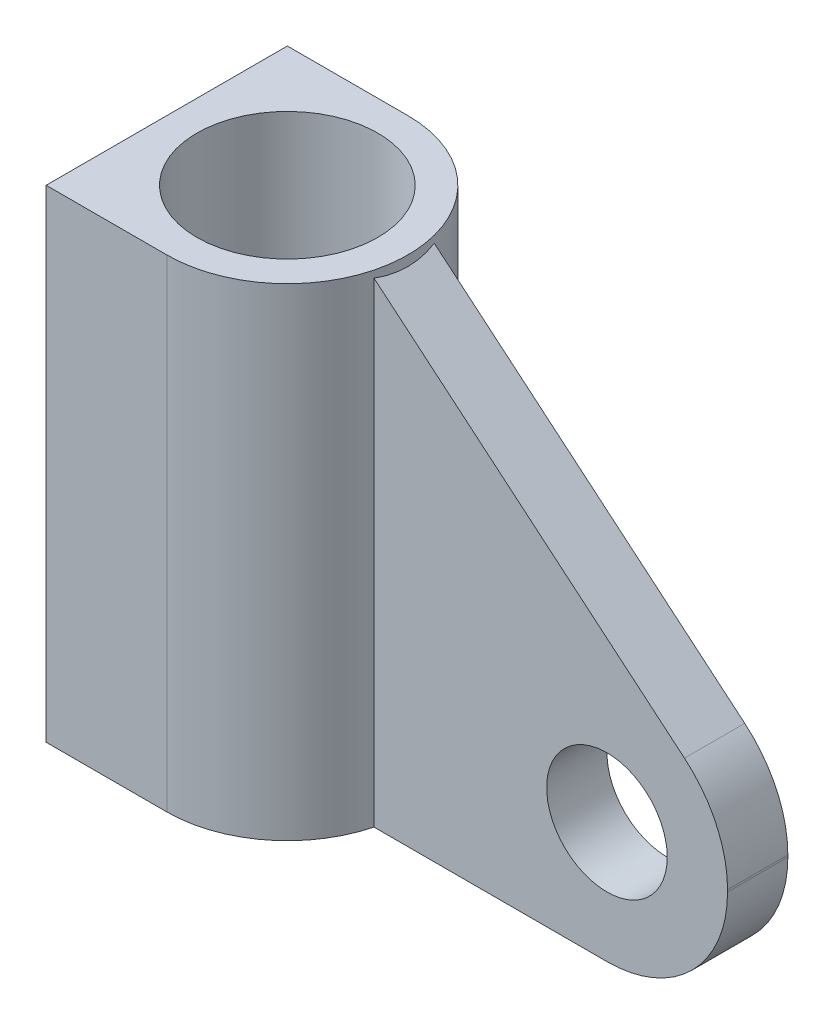
ISO-10303-21;
HEADER;
FILE_DESCRIPTION(('STEP AP214'),'2;1');
FILE_NAME('part.step','',(''),(''),'','','');
FILE_SCHEMA(('AUTOMOTIVE_DESIGN { 1 0 10303 214 1 1 1 1 }'));
ENDSEC;
DATA;
#1=APPLICATION_CONTEXT('core data for automotive mechanical design processes');
#2=APPLICATION_PROTOCOL_DEFINITION('international standard','automotive_design',2000,#1);
#3=PRODUCT_CONTEXT('',#1,'mechanical');
#4=PRODUCT('Part','Part','',(#3));
#5=PRODUCT_RELATED_PRODUCT_CATEGORY('part','',(#4));
#6=PRODUCT_DEFINITION_FORMATION('','',#4);
#7=PRODUCT_DEFINITION_CONTEXT('part definition',#1,'design');
#8=PRODUCT_DEFINITION('design','',#6,#7);
#9=PRODUCT_DEFINITION_SHAPE('','',#8);
#10=(LENGTH_UNIT() NAMED_UNIT(*) SI_UNIT(.MILLI.,.METRE.));
#11=(NAMED_UNIT(*) PLANE_ANGLE_UNIT() SI_UNIT($,.RADIAN.));
#12=(NAMED_UNIT(*) SI_UNIT($,.STERADIAN.) SOLID_ANGLE_UNIT());
#13=UNCERTAINTY_MEASURE_WITH_UNIT(LENGTH_MEASURE(1.E-05),#10,'distance_accuracy_value','');
#14=(GEOMETRIC_REPRESENTATION_CONTEXT(3) GLOBAL_UNCERTAINTY_ASSIGNED_CONTEXT((#13)) GLOBAL_UNIT_ASSIGNED_CONTEXT((#10,
#11,#12)) REPRESENTATION_CONTEXT('',''));
#15=CARTESIAN_POINT('',(0.,0.,0.));
#16=DIRECTION('',(0.,0.,1.));
#17=DIRECTION('',(1.,0.,0.));
#18=AXIS2_PLACEMENT_3D('',#15,#16,#17);
#19=CARTESIAN_POINT('',(0.,12.7,0.));
#20=DIRECTION('',(0.,-1.,0.));
#21=DIRECTION('',(0.,0.,-1.));
#22=AXIS2_PLACEMENT_3D('',#19,#20,#21);
#23=CYLINDRICAL_SURFACE('',#22,6.35);
#24=CARTESIAN_POINT('',(0.,12.7,0.));
#25=DIRECTION('',(0.,1.,0.));
#26=DIRECTION('',(0.,0.,1.));
#27=AXIS2_PLACEMENT_3D('',#24,#25,#26);
#28=CIRCLE('',#27,6.35);
#29=CARTESIAN_POINT('',(0.,12.7,6.35));
#30=VERTEX_POINT('',#29);
#31=CARTESIAN_POINT('',(0.,12.7,-6.35));
#32=VERTEX_POINT('',#31);
#33=EDGE_CURVE('E122',#30,#32,#28,.T.);
#34=ORIENTED_EDGE('',*,*,#33,.F.);
#35=DIRECTION('',(0.,-1.,0.));
#36=VECTOR('',#35,1.);
#37=CARTESIAN_POINT('',(0.,12.7,6.35));
#38=LINE('',#37,#36);
#39=CARTESIAN_POINT('',(0.,-12.7,6.35));
#40=VERTEX_POINT('',#39);
#41=EDGE_CURVE('E110',#40,#30,#38,.F.);
#42=ORIENTED_EDGE('',*,*,#41,.F.);
#43=CARTESIAN_POINT('',(0.,-12.7,0.));
#44=DIRECTION('',(0.,1.,0.));
#45=DIRECTION('',(0.,0.,1.));
#46=AXIS2_PLACEMENT_3D('',#43,#44,#45);
#47=CIRCLE('',#46,6.35);
#48=CARTESIAN_POINT('',(6.14836106210427,-12.7,1.5875));
#49=VERTEX_POINT('',#48);
#50=EDGE_CURVE('E120',#40,#49,#47,.T.);
#51=ORIENTED_EDGE('',*,*,#50,.T.);
#52=DIRECTION('',(0.,-1.,0.));
#53=VECTOR('',#52,1.);
#54=CARTESIAN_POINT('',(6.14836106210427,12.7,1.5875));
#55=LINE('',#54,#53);
#56=CARTESIAN_POINT('',(6.14836106210427,12.3363668926217,1.5875));
#57=VERTEX_POINT('',#56);
#58=EDGE_CURVE('E11',#49,#57,#55,.F.);
#59=ORIENTED_EDGE('',*,*,#58,.T.);
#60=CARTESIAN_POINT('',(0.,17.4954543921782,0.));
#61=DIRECTION('',(-0.642787609686543,-0.766044443118975,0.));
#62=DIRECTION('',(0.766044443118975,-0.642787609686543,0.));
#63=AXIS2_PLACEMENT_3D('',#60,#61,#62);
#64=ELLIPSE('',#63,8.28933628726001,6.35);
#65=CARTESIAN_POINT('',(6.14836106210428,12.3363668926217,-1.5875));
#66=VERTEX_POINT('',#65);
#67=EDGE_CURVE('E39',#66,#57,#64,.T.);
#68=ORIENTED_EDGE('',*,*,#67,.F.);
#69=DIRECTION('',(0.,-1.,0.));
#70=VECTOR('',#69,1.);
#71=CARTESIAN_POINT('',(6.14836106210427,12.7,-1.5875));
#72=LINE('',#71,#70);
#73=CARTESIAN_POINT('',(6.14836106210427,-12.7,-1.5875));
#74=VERTEX_POINT('',#73);
#75=EDGE_CURVE('E50',#74,#66,#72,.F.);
#76=ORIENTED_EDGE('',*,*,#75,.F.);
#77=CARTESIAN_POINT('',(0.,-12.7,-6.35));
#78=VERTEX_POINT('',#77);
#79=EDGE_CURVE('E129',#74,#78,#47,.T.);
#80=ORIENTED_EDGE('',*,*,#79,.T.);
#81=DIRECTION('',(0.,-1.,0.));
#82=VECTOR('',#81,1.);
#83=CARTESIAN_POINT('',(0.,12.7,-6.35));
#84=LINE('',#83,#82);
#85=EDGE_CURVE('E226',#78,#32,#84,.F.);
#86=ORIENTED_EDGE('',*,*,#85,.T.);
#87=EDGE_LOOP('',(#34,#42,#51,#59,#68,#76,#80,#86));
#88=FACE_BOUND('',#87,.T.);
#89=ADVANCED_FACE('F31',(#88),#23,.T.);
#90=CARTESIAN_POINT('',(0.,12.7,0.));
#91=DIRECTION('',(0.,1.,0.));
#92=DIRECTION('',(0.,0.,1.));
#93=AXIS2_PLACEMENT_3D('',#90,#91,#92);
#94=PLANE('',#93);
#95=DIRECTION('',(0.,0.,-1.));
#96=VECTOR('',#95,1.);
#97=CARTESIAN_POINT('',(-6.35,12.7,-6.35));
#98=LINE('',#97,#96);
#99=CARTESIAN_POINT('',(-6.35,12.7,6.35));
#100=VERTEX_POINT('',#99);
#101=CARTESIAN_POINT('',(-6.35,12.7,-6.35));
#102=VERTEX_POINT('',#101);
#103=EDGE_CURVE('E208',#100,#102,#98,.T.);
#104=ORIENTED_EDGE('',*,*,#103,.F.);
#105=DIRECTION('',(-1.,0.,0.));
#106=VECTOR('',#105,1.);
#107=CARTESIAN_POINT('',(500000.,12.7,6.35));
#108=LINE('',#107,#106);
#109=EDGE_CURVE('E117',#30,#100,#108,.T.);
#110=ORIENTED_EDGE('',*,*,#109,.F.);
#111=ORIENTED_EDGE('',*,*,#33,.T.);
#112=DIRECTION('',(-1.,0.,0.));
#113=VECTOR('',#112,1.);
#114=CARTESIAN_POINT('',(500000.,12.7,-6.35));
#115=LINE('',#114,#113);
#116=EDGE_CURVE('E211',#32,#102,#115,.T.);
#117=ORIENTED_EDGE('',*,*,#116,.T.);
#118=EDGE_LOOP('',(#104,#110,#111,#117));
#119=FACE_BOUND('',#118,.T.);
#120=CARTESIAN_POINT('',(0.,12.7,0.));
#121=DIRECTION('',(0.,1.,0.));
#122=DIRECTION('',(0.,0.,1.));
#123=AXIS2_PLACEMENT_3D('',#120,#121,#122);
#124=CIRCLE('',#123,4.7625);
#125=CARTESIAN_POINT('',(0.,12.7,4.7625));
#126=VERTEX_POINT('',#125);
#127=EDGE_CURVE('E130',#126,#126,#124,.T.);
#128=ORIENTED_EDGE('',*,*,#127,.F.);
#129=EDGE_LOOP('',(#128));
#130=FACE_BOUND('',#129,.T.);
#131=ADVANCED_FACE('F195',(#119,#130),#94,.T.);
#132=CARTESIAN_POINT('',(0.,-12.7,0.));
#133=DIRECTION('',(0.,1.,0.));
#134=DIRECTION('',(0.,0.,1.));
#135=AXIS2_PLACEMENT_3D('',#132,#133,#134);
#136=PLANE('',#135);
#137=DIRECTION('',(1.,0.,0.));
#138=VECTOR('',#137,1.);
#139=CARTESIAN_POINT('',(5.715,-12.7,1.5875));
#140=LINE('',#139,#138);
#141=CARTESIAN_POINT('',(18.415,-12.7,1.5875));
#142=VERTEX_POINT('',#141);
#143=EDGE_CURVE('E128',#49,#142,#140,.T.);
#144=ORIENTED_EDGE('',*,*,#143,.F.);
#145=ORIENTED_EDGE('',*,*,#50,.F.);
#146=DIRECTION('',(-1.,0.,0.));
#147=VECTOR('',#146,1.);
#148=CARTESIAN_POINT('',(500000.,-12.7,6.35));
#149=LINE('',#148,#147);
#150=CARTESIAN_POINT('',(-6.35,-12.7,6.35));
#151=VERTEX_POINT('',#150);
#152=EDGE_CURVE('E106',#40,#151,#149,.T.);
#153=ORIENTED_EDGE('',*,*,#152,.T.);
#154=DIRECTION('',(0.,0.,1.));
#155=VECTOR('',#154,1.);
#156=CARTESIAN_POINT('',(-6.35,-12.7,-6.35));
#157=LINE('',#156,#155);
#158=CARTESIAN_POINT('',(-6.35,-12.7,-6.35));
#159=VERTEX_POINT('',#158);
#160=EDGE_CURVE('E215',#159,#151,#157,.T.);
#161=ORIENTED_EDGE('',*,*,#160,.F.);
#162=DIRECTION('',(-1.,0.,0.));
#163=VECTOR('',#162,1.);
#164=CARTESIAN_POINT('',(500000.,-12.7,-6.35));
#165=LINE('',#164,#163);
#166=EDGE_CURVE('E224',#78,#159,#165,.T.);
#167=ORIENTED_EDGE('',*,*,#166,.F.);
#168=ORIENTED_EDGE('',*,*,#79,.F.);
#169=DIRECTION('',(1.,0.,0.));
#170=VECTOR('',#169,1.);
#171=CARTESIAN_POINT('',(5.715,-12.7,-1.5875));
#172=LINE('',#171,#170);
#173=CARTESIAN_POINT('',(18.415,-12.7,-1.5875));
#174=VERTEX_POINT('',#173);
#175=EDGE_CURVE('E169',#74,#174,#172,.T.);
#176=ORIENTED_EDGE('',*,*,#175,.T.);
#177=DIRECTION('',(0.,0.,-1.));
#178=VECTOR('',#177,1.);
#179=CARTESIAN_POINT('',(18.415,-12.7,1.5875));
#180=LINE('',#179,#178);
#181=EDGE_CURVE('E181',#142,#174,#180,.T.);
#182=ORIENTED_EDGE('',*,*,#181,.F.);
#183=EDGE_LOOP('',(#144,#145,#153,#161,#167,#168,#176,#182));
#184=FACE_BOUND('',#183,.T.);
#185=CARTESIAN_POINT('',(0.,-12.7,0.));
#186=DIRECTION('',(0.,1.,0.));
#187=DIRECTION('',(0.,0.,1.));
#188=AXIS2_PLACEMENT_3D('',#185,#186,#187);
#189=CIRCLE('',#188,4.7625);
#190=CARTESIAN_POINT('',(0.,-12.7,4.7625));
#191=VERTEX_POINT('',#190);
#192=EDGE_CURVE('E133',#191,#191,#189,.T.);
#193=ORIENTED_EDGE('',*,*,#192,.T.);
#194=EDGE_LOOP('',(#193));
#195=FACE_BOUND('',#194,.T.);
#196=ADVANCED_FACE('F125',(#184,#195),#136,.F.);
#197=CARTESIAN_POINT('',(0.,12.7,0.));
#198=DIRECTION('',(0.,-1.,0.));
#199=DIRECTION('',(0.,0.,-1.));
#200=AXIS2_PLACEMENT_3D('',#197,#198,#199);
#201=CYLINDRICAL_SURFACE('',#200,4.7625);
#202=ORIENTED_EDGE('',*,*,#127,.T.);
#203=EDGE_LOOP('',(#202));
#204=FACE_BOUND('',#203,.T.);
#205=ORIENTED_EDGE('',*,*,#192,.F.);
#206=EDGE_LOOP('',(#205));
#207=FACE_BOUND('',#206,.T.);
#208=ADVANCED_FACE('F186',(#204,#207),#201,.F.);
#209=CARTESIAN_POINT('',(22.4967013215096,-1.38151938940609,1.5875));
#210=DIRECTION('',(-0.642787609686543,-0.766044443118975,0.));
#211=DIRECTION('',(0.766044443118975,-0.642787609686543,0.));
#212=AXIS2_PLACEMENT_3D('',#209,#210,#211);
#213=PLANE('',#212);
#214=DIRECTION('',(-0.766044443118975,0.642787609686543,0.));
#215=VECTOR('',#214,1.);
#216=CARTESIAN_POINT('',(22.4967013215096,-1.38151938940609,-1.5875));
#217=LINE('',#216,#215);
#218=CARTESIAN_POINT('',(22.4967013215096,-1.38151938940609,-1.5875));
#219=VERTEX_POINT('',#218);
#220=EDGE_CURVE('E147',#219,#66,#217,.T.);
#221=ORIENTED_EDGE('',*,*,#220,.T.);
#222=ORIENTED_EDGE('',*,*,#67,.T.);
#223=DIRECTION('',(-0.766044443118975,0.642787609686543,0.));
#224=VECTOR('',#223,1.);
#225=CARTESIAN_POINT('',(22.4967013215096,-1.38151938940609,1.5875));
#226=LINE('',#225,#224);
#227=CARTESIAN_POINT('',(22.4967013215096,-1.38151938940609,1.5875));
#228=VERTEX_POINT('',#227);
#229=EDGE_CURVE('E145',#228,#57,#226,.T.);
#230=ORIENTED_EDGE('',*,*,#229,.F.);
#231=DIRECTION('',(0.,0.,-1.));
#232=VECTOR('',#231,1.);
#233=CARTESIAN_POINT('',(22.4967013215096,-1.38151938940609,1.5875));
#234=LINE('',#233,#232);
#235=EDGE_CURVE('E167',#228,#219,#234,.T.);
#236=ORIENTED_EDGE('',*,*,#235,.T.);
#237=EDGE_LOOP('',(#221,#222,#230,#236));
#238=FACE_BOUND('',#237,.T.);
#239=ADVANCED_FACE('F143',(#238),#213,.F.);
#240=CARTESIAN_POINT('',(18.415,-6.35,1.5875));
#241=DIRECTION('',(0.,0.,1.));
#242=DIRECTION('',(1.,0.,0.));
#243=AXIS2_PLACEMENT_3D('',#240,#241,#242);
#244=PLANE('',#243);
#245=CARTESIAN_POINT('',(18.415,-6.35,1.5875));
#246=DIRECTION('',(0.,0.,1.));
#247=DIRECTION('',(1.,0.,0.));
#248=AXIS2_PLACEMENT_3D('',#245,#246,#247);
#249=CIRCLE('',#248,3.175);
#250=CARTESIAN_POINT('',(21.59,-6.35,1.5875));
#251=VERTEX_POINT('',#250);
#252=EDGE_CURVE('E160',#251,#251,#249,.T.);
#253=ORIENTED_EDGE('',*,*,#252,.F.);
#254=EDGE_LOOP('',(#253));
#255=FACE_BOUND('',#254,.T.);
#256=ORIENTED_EDGE('',*,*,#58,.F.);
#257=ORIENTED_EDGE('',*,*,#143,.T.);
#258=CARTESIAN_POINT('',(18.415,-6.35,1.5875));
#259=DIRECTION('',(0.,0.,1.));
#260=DIRECTION('',(1.,0.,0.));
#261=AXIS2_PLACEMENT_3D('',#258,#259,#260);
#262=CIRCLE('',#261,6.35);
#263=CARTESIAN_POINT('',(24.765,-6.34999999999995,1.5875));
#264=VERTEX_POINT('',#263);
#265=EDGE_CURVE('E155',#142,#264,#262,.T.);
#266=ORIENTED_EDGE('',*,*,#265,.T.);
#267=DIRECTION('',(0.,1.,0.));
#268=VECTOR('',#267,1.);
#269=CARTESIAN_POINT('',(24.765,-6.34999999999995,1.5875));
#270=LINE('',#269,#268);
#271=CARTESIAN_POINT('',(24.765,-6.24590160321158,1.5875));
#272=VERTEX_POINT('',#271);
#273=EDGE_CURVE('E164',#264,#272,#270,.T.);
#274=ORIENTED_EDGE('',*,*,#273,.T.);
#275=CARTESIAN_POINT('',(18.415,-6.24590160321158,1.5875));
#276=DIRECTION('',(0.,0.,1.));
#277=DIRECTION('',(1.,0.,0.));
#278=AXIS2_PLACEMENT_3D('',#275,#276,#277);
#279=CIRCLE('',#278,6.35);
#280=EDGE_CURVE('E151',#272,#228,#279,.T.);
#281=ORIENTED_EDGE('',*,*,#280,.T.);
#282=ORIENTED_EDGE('',*,*,#229,.T.);
#283=EDGE_LOOP('',(#256,#257,#266,#274,#281,#282));
#284=FACE_BOUND('',#283,.T.);
#285=ADVANCED_FACE('F149',(#255,#284),#244,.T.);
#286=CARTESIAN_POINT('',(18.415,-6.35,-1.5875));
#287=DIRECTION('',(0.,0.,1.));
#288=DIRECTION('',(1.,0.,0.));
#289=AXIS2_PLACEMENT_3D('',#286,#287,#288);
#290=PLANE('',#289);
#291=CARTESIAN_POINT('',(18.415,-6.35,-1.5875));
#292=DIRECTION('',(0.,0.,1.));
#293=DIRECTION('',(1.,0.,0.));
#294=AXIS2_PLACEMENT_3D('',#291,#292,#293);
#295=CIRCLE('',#294,3.175);
#296=CARTESIAN_POINT('',(21.59,-6.35,-1.5875));
#297=VERTEX_POINT('',#296);
#298=EDGE_CURVE('E34',#297,#297,#295,.T.);
#299=ORIENTED_EDGE('',*,*,#298,.T.);
#300=EDGE_LOOP('',(#299));
#301=FACE_BOUND('',#300,.T.);
#302=ORIENTED_EDGE('',*,*,#175,.F.);
#303=ORIENTED_EDGE('',*,*,#75,.T.);
#304=ORIENTED_EDGE('',*,*,#220,.F.);
#305=CARTESIAN_POINT('',(18.415,-6.24590160321158,-1.5875));
#306=DIRECTION('',(0.,0.,1.));
#307=DIRECTION('',(1.,0.,0.));
#308=AXIS2_PLACEMENT_3D('',#305,#306,#307);
#309=CIRCLE('',#308,6.35);
#310=CARTESIAN_POINT('',(24.765,-6.24590160321158,-1.5875));
#311=VERTEX_POINT('',#310);
#312=EDGE_CURVE('E153',#311,#219,#309,.T.);
#313=ORIENTED_EDGE('',*,*,#312,.F.);
#314=DIRECTION('',(0.,1.,0.));
#315=VECTOR('',#314,1.);
#316=CARTESIAN_POINT('',(24.765,-6.34999999999995,-1.5875));
#317=LINE('',#316,#315);
#318=CARTESIAN_POINT('',(24.765,-6.34999999999995,-1.5875));
#319=VERTEX_POINT('',#318);
#320=EDGE_CURVE('E157',#319,#311,#317,.T.);
#321=ORIENTED_EDGE('',*,*,#320,.F.);
#322=CARTESIAN_POINT('',(18.415,-6.35,-1.5875));
#323=DIRECTION('',(0.,0.,1.));
#324=DIRECTION('',(1.,0.,0.));
#325=AXIS2_PLACEMENT_3D('',#322,#323,#324);
#326=CIRCLE('',#325,6.35);
#327=EDGE_CURVE('E171',#174,#319,#326,.T.);
#328=ORIENTED_EDGE('',*,*,#327,.F.);
#329=EDGE_LOOP('',(#302,#303,#304,#313,#321,#328));
#330=FACE_BOUND('',#329,.T.);
#331=ADVANCED_FACE('F233',(#301,#330),#290,.F.);
#332=CARTESIAN_POINT('',(18.415,-6.35,1.5875));
#333=DIRECTION('',(0.,0.,-1.));
#334=DIRECTION('',(-1.,0.,0.));
#335=AXIS2_PLACEMENT_3D('',#332,#333,#334);
#336=CYLINDRICAL_SURFACE('',#335,6.35);
#337=ORIENTED_EDGE('',*,*,#327,.T.);
#338=DIRECTION('',(0.,0.,-1.));
#339=VECTOR('',#338,1.);
#340=CARTESIAN_POINT('',(24.765,-6.34999999999995,1.5875));
#341=LINE('',#340,#339);
#342=EDGE_CURVE('E178',#264,#319,#341,.T.);
#343=ORIENTED_EDGE('',*,*,#342,.F.);
#344=ORIENTED_EDGE('',*,*,#265,.F.);
#345=ORIENTED_EDGE('',*,*,#181,.T.);
#346=EDGE_LOOP('',(#337,#343,#344,#345));
#347=FACE_BOUND('',#346,.T.);
#348=ADVANCED_FACE('F255',(#347),#336,.T.);
#349=CARTESIAN_POINT('',(24.765,-6.34999999999995,1.5875));
#350=DIRECTION('',(-1.,0.,0.));
#351=DIRECTION('',(0.,0.,1.));
#352=AXIS2_PLACEMENT_3D('',#349,#350,#351);
#353=PLANE('',#352);
#354=ORIENTED_EDGE('',*,*,#320,.T.);
#355=DIRECTION('',(0.,0.,-1.));
#356=VECTOR('',#355,1.);
#357=CARTESIAN_POINT('',(24.765,-6.24590160321158,1.5875));
#358=LINE('',#357,#356);
#359=EDGE_CURVE('E175',#272,#311,#358,.T.);
#360=ORIENTED_EDGE('',*,*,#359,.F.);
#361=ORIENTED_EDGE('',*,*,#273,.F.);
#362=ORIENTED_EDGE('',*,*,#342,.T.);
#363=EDGE_LOOP('',(#354,#360,#361,#362));
#364=FACE_BOUND('',#363,.T.);
#365=ADVANCED_FACE('F246',(#364),#353,.F.);
#366=CARTESIAN_POINT('',(18.415,-6.24590160321158,1.5875));
#367=DIRECTION('',(0.,0.,-1.));
#368=DIRECTION('',(-1.,0.,0.));
#369=AXIS2_PLACEMENT_3D('',#366,#367,#368);
#370=CYLINDRICAL_SURFACE('',#369,6.35);
#371=ORIENTED_EDGE('',*,*,#312,.T.);
#372=ORIENTED_EDGE('',*,*,#235,.F.);
#373=ORIENTED_EDGE('',*,*,#280,.F.);
#374=ORIENTED_EDGE('',*,*,#359,.T.);
#375=EDGE_LOOP('',(#371,#372,#373,#374));
#376=FACE_BOUND('',#375,.T.);
#377=ADVANCED_FACE('F239',(#376),#370,.T.);
#378=CARTESIAN_POINT('',(18.415,-6.35,-6.35));
#379=DIRECTION('',(0.,0.,1.));
#380=DIRECTION('',(1.,0.,0.));
#381=AXIS2_PLACEMENT_3D('',#378,#379,#380);
#382=CYLINDRICAL_SURFACE('',#381,3.175);
#383=ORIENTED_EDGE('',*,*,#252,.T.);
#384=EDGE_LOOP('',(#383));
#385=FACE_BOUND('',#384,.T.);
#386=ORIENTED_EDGE('',*,*,#298,.F.);
#387=EDGE_LOOP('',(#386));
#388=FACE_BOUND('',#387,.T.);
#389=ADVANCED_FACE('F236',(#385,#388),#382,.F.);
#390=CARTESIAN_POINT('',(500000.,12.7,-6.35));
#391=DIRECTION('',(0.,0.,-1.));
#392=DIRECTION('',(-1.,0.,0.));
#393=AXIS2_PLACEMENT_3D('',#390,#391,#392);
#394=PLANE('',#393);
#395=ORIENTED_EDGE('',*,*,#85,.F.);
#396=ORIENTED_EDGE('',*,*,#166,.T.);
#397=DIRECTION('',(0.,-1.,0.));
#398=VECTOR('',#397,1.);
#399=CARTESIAN_POINT('',(-6.35,12.7,-6.35));
#400=LINE('',#399,#398);
#401=EDGE_CURVE('E219',#102,#159,#400,.T.);
#402=ORIENTED_EDGE('',*,*,#401,.F.);
#403=ORIENTED_EDGE('',*,*,#116,.F.);
#404=EDGE_LOOP('',(#395,#396,#402,#403));
#405=FACE_BOUND('',#404,.T.);
#406=ADVANCED_FACE('F238',(#405),#394,.T.);
#407=CARTESIAN_POINT('',(-6.35,-12.7,-6.35));
#408=DIRECTION('',(-1.,0.,0.));
#409=DIRECTION('',(0.,0.,1.));
#410=AXIS2_PLACEMENT_3D('',#407,#408,#409);
#411=PLANE('',#410);
#412=ORIENTED_EDGE('',*,*,#160,.T.);
#413=DIRECTION('',(0.,1.,0.));
#414=VECTOR('',#413,1.);
#415=CARTESIAN_POINT('',(-6.35,12.7,6.35));
#416=LINE('',#415,#414);
#417=EDGE_CURVE('E113',#151,#100,#416,.T.);
#418=ORIENTED_EDGE('',*,*,#417,.T.);
#419=ORIENTED_EDGE('',*,*,#103,.T.);
#420=ORIENTED_EDGE('',*,*,#401,.T.);
#421=EDGE_LOOP('',(#412,#418,#419,#420));
#422=FACE_BOUND('',#421,.T.);
#423=ADVANCED_FACE('F218',(#422),#411,.T.);
#424=CARTESIAN_POINT('',(500000.,12.7,6.35));
#425=DIRECTION('',(0.,0.,1.));
#426=DIRECTION('',(1.,0.,0.));
#427=AXIS2_PLACEMENT_3D('',#424,#425,#426);
#428=PLANE('',#427);
#429=ORIENTED_EDGE('',*,*,#152,.F.);
#430=ORIENTED_EDGE('',*,*,#41,.T.);
#431=ORIENTED_EDGE('',*,*,#109,.T.);
#432=ORIENTED_EDGE('',*,*,#417,.F.);
#433=EDGE_LOOP('',(#429,#430,#431,#432));
#434=FACE_BOUND('',#433,.T.);
#435=ADVANCED_FACE('F108',(#434),#428,.T.);
#436=CLOSED_SHELL('',(#89,#131,#196,#208,#239,#285,#331,#348,#365,#377,#389,#406,#423,#435));
#437=MANIFOLD_SOLID_BREP('B2',#436);
#438=ADVANCED_BREP_SHAPE_REPRESENTATION('',(#18,#437),#14);
#439=SHAPE_DEFINITION_REPRESENTATION(#9,#438);
ENDSEC;
END-ISO-10303-21;
